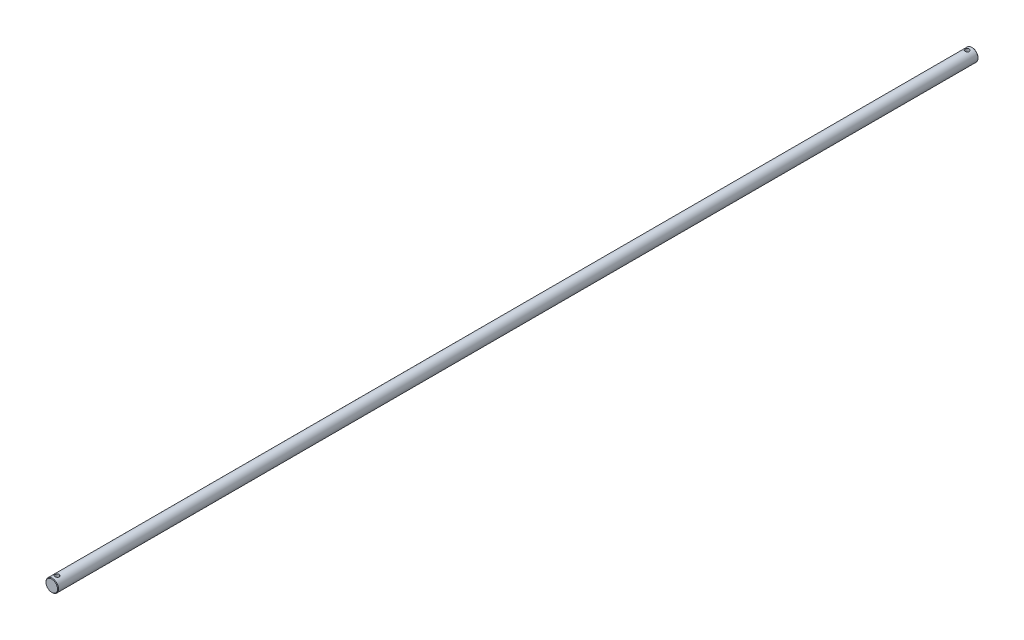
ISO-10303-21;
HEADER;
FILE_DESCRIPTION(('STEP AP214'),'2;1');
FILE_NAME('part.step','',(''),(''),'','','');
FILE_SCHEMA(('AUTOMOTIVE_DESIGN { 1 0 10303 214 1 1 1 1 }'));
ENDSEC;
DATA;
#1=APPLICATION_CONTEXT('core data for automotive mechanical design processes');
#2=APPLICATION_PROTOCOL_DEFINITION('international standard','automotive_design',2000,#1);
#3=PRODUCT_CONTEXT('',#1,'mechanical');
#4=PRODUCT('Part','Part','',(#3));
#5=PRODUCT_RELATED_PRODUCT_CATEGORY('part','',(#4));
#6=PRODUCT_DEFINITION_FORMATION('','',#4);
#7=PRODUCT_DEFINITION_CONTEXT('part definition',#1,'design');
#8=PRODUCT_DEFINITION('design','',#6,#7);
#9=PRODUCT_DEFINITION_SHAPE('','',#8);
#10=(LENGTH_UNIT() NAMED_UNIT(*) SI_UNIT(.MILLI.,.METRE.));
#11=(NAMED_UNIT(*) PLANE_ANGLE_UNIT() SI_UNIT($,.RADIAN.));
#12=(NAMED_UNIT(*) SI_UNIT($,.STERADIAN.) SOLID_ANGLE_UNIT());
#13=UNCERTAINTY_MEASURE_WITH_UNIT(LENGTH_MEASURE(1.E-05),#10,'distance_accuracy_value','');
#14=(GEOMETRIC_REPRESENTATION_CONTEXT(3) GLOBAL_UNCERTAINTY_ASSIGNED_CONTEXT((#13)) GLOBAL_UNIT_ASSIGNED_CONTEXT((#10,
#11,#12)) REPRESENTATION_CONTEXT('',''));
#15=CARTESIAN_POINT('',(0.,0.,0.));
#16=DIRECTION('',(0.,0.,1.));
#17=DIRECTION('',(1.,0.,0.));
#18=AXIS2_PLACEMENT_3D('',#15,#16,#17);
#19=CARTESIAN_POINT('',(0.,0.,-880.));
#20=DIRECTION('',(0.,0.,1.));
#21=DIRECTION('',(1.,0.,0.));
#22=AXIS2_PLACEMENT_3D('',#19,#20,#21);
#23=CYLINDRICAL_SURFACE('',#22,12.);
#24=CARTESIAN_POINT('',(0.,0.,879.));
#25=DIRECTION('',(0.,0.,1.));
#26=DIRECTION('',(1.,0.,0.));
#27=AXIS2_PLACEMENT_3D('',#24,#25,#26);
#28=CIRCLE('',#27,12.);
#29=CARTESIAN_POINT('',(12.,0.,879.));
#30=VERTEX_POINT('',#29);
#31=EDGE_CURVE('E42',#30,#30,#28,.F.);
#32=ORIENTED_EDGE('',*,*,#31,.T.);
#33=EDGE_LOOP('',(#32));
#34=FACE_BOUND('',#33,.T.);
#35=CARTESIAN_POINT('',(0.,0.,-879.000000000001));
#36=DIRECTION('',(0.,0.,1.));
#37=DIRECTION('',(1.,0.,0.));
#38=AXIS2_PLACEMENT_3D('',#35,#36,#37);
#39=CIRCLE('',#38,12.);
#40=CARTESIAN_POINT('',(12.,0.,-879.000000000001));
#41=VERTEX_POINT('',#40);
#42=EDGE_CURVE('E46',#41,#41,#39,.T.);
#43=ORIENTED_EDGE('',*,*,#42,.T.);
#44=EDGE_LOOP('',(#43));
#45=FACE_BOUND('',#44,.T.);
#46=CARTESIAN_POINT('',(0.,-12.,874.));
#47=CARTESIAN_POINT('',(0.218253451546889,-12.0000006120378,874.000001014927));
#48=CARTESIAN_POINT('',(0.436500778154188,-11.9939907803018,873.982078935491));
#49=CARTESIAN_POINT('',(0.866567043491888,-11.9706084081312,873.911083564731));
#50=CARTESIAN_POINT('',(1.07838531247529,-11.9532346880861,873.858006624204));
#51=CARTESIAN_POINT('',(1.48933115800712,-11.9090123162577,873.718723026464));
#52=CARTESIAN_POINT('',(1.68847930354413,-11.8821795092341,873.632571750163));
#53=CARTESIAN_POINT('',(2.06949974722129,-11.8217778286937,873.429835308647));
#54=CARTESIAN_POINT('',(2.25136862783485,-11.7882076267112,873.31324413999));
#55=CARTESIAN_POINT('',(2.59896670008907,-11.7165637777201,873.048696780565));
#56=CARTESIAN_POINT('',(2.76401480119319,-11.6783822585509,872.899875062958));
#57=CARTESIAN_POINT('',(3.06733077080831,-11.6024125913254,872.576931381174));
#58=CARTESIAN_POINT('',(3.2055927419579,-11.5646245316238,872.402803860286));
#59=CARTESIAN_POINT('',(3.45529976891137,-11.4925332990891,872.028059539214));
#60=CARTESIAN_POINT('',(3.56585943288387,-11.4583615710204,871.826825041071));
#61=CARTESIAN_POINT('',(3.75127549551108,-11.3990122167512,871.407295622166));
#62=CARTESIAN_POINT('',(3.82614278954791,-11.3738318464566,871.189005931351));
#63=CARTESIAN_POINT('',(3.93549384603581,-11.3364521307492,870.749307114012));
#64=CARTESIAN_POINT('',(3.97125379308399,-11.3238438306895,870.528251166038));
#65=CARTESIAN_POINT('',(4.005364493341,-11.3118262652752,870.082944983383));
#66=CARTESIAN_POINT('',(4.0037268064304,-11.312412921263,869.858695757186));
#67=CARTESIAN_POINT('',(3.96407961480177,-11.3263605999899,869.424253478192));
#68=CARTESIAN_POINT('',(3.92773565262442,-11.3391366334693,869.213886388226));
#69=CARTESIAN_POINT('',(3.82242465135523,-11.3750663077523,868.802426321479));
#70=CARTESIAN_POINT('',(3.75345370635799,-11.3982211910317,868.601334458238));
#71=CARTESIAN_POINT('',(3.58375623225407,-11.4527164455868,868.210349001664));
#72=CARTESIAN_POINT('',(3.48253619483259,-11.4841826318151,868.02068789813));
#73=CARTESIAN_POINT('',(3.25155642520899,-11.5517023429386,867.660516366873));
#74=CARTESIAN_POINT('',(3.12178844945504,-11.5877571915937,867.490011492264));
#75=CARTESIAN_POINT('',(2.82939733072993,-11.6626931667357,867.163633607359));
#76=CARTESIAN_POINT('',(2.66541260030544,-11.7016235742007,867.008989221964));
#77=CARTESIAN_POINT('',(2.31335827987991,-11.7762775354745,866.729074933346));
#78=CARTESIAN_POINT('',(2.12528638264315,-11.8120007815208,866.603807847342));
#79=CARTESIAN_POINT('',(1.72779045218514,-11.8766843175136,866.38521479906));
#80=CARTESIAN_POINT('',(1.51817310566535,-11.9055740003221,866.292218034637));
#81=CARTESIAN_POINT('',(1.08507633345799,-11.9528226857769,866.143187304177));
#82=CARTESIAN_POINT('',(0.861601752619789,-11.971185346195,866.087140498306));
#83=CARTESIAN_POINT('',(0.417535318117199,-11.9947050828577,866.015777335911));
#84=CARTESIAN_POINT('',(0.197238399459361,-12.0004000733492,865.998800763309));
#85=CARTESIAN_POINT('',(-0.243100279840978,-11.9995561077931,866.001330694394));
#86=CARTESIAN_POINT('',(-0.463142077278628,-11.9930192167745,866.020831039919));
#87=CARTESIAN_POINT('',(-0.890079465217045,-11.9688009886842,866.094447630944));
#88=CARTESIAN_POINT('',(-1.09717122733939,-11.9514479484477,866.147544824198));
#89=CARTESIAN_POINT('',(-1.4994238343183,-11.9076738732028,866.285573777867));
#90=CARTESIAN_POINT('',(-1.69458315403442,-11.881251681867,866.370509597871));
#91=CARTESIAN_POINT('',(-2.07315318557309,-11.8211572514916,866.572281727363));
#92=CARTESIAN_POINT('',(-2.2561198368686,-11.7873125902314,866.689898373133));
#93=CARTESIAN_POINT('',(-2.60025932054236,-11.7162101566505,866.952776600054));
#94=CARTESIAN_POINT('',(-2.7614254711823,-11.6789513437531,867.098046624127));
#95=CARTESIAN_POINT('',(-3.06501003122518,-11.6030739192178,867.419915004026));
#96=CARTESIAN_POINT('',(-3.20624387698308,-11.5644704434971,867.597636907707));
#97=CARTESIAN_POINT('',(-3.4570300892943,-11.4919989317883,867.975086271244));
#98=CARTESIAN_POINT('',(-3.56658219172405,-11.4581309352801,868.174813914536));
#99=CARTESIAN_POINT('',(-3.75038772166543,-11.3992956716553,868.59069206116));
#100=CARTESIAN_POINT('',(-3.82471252866007,-11.3743104317192,868.806808316675));
#101=CARTESIAN_POINT('',(-3.93557866703742,-11.336433292258,869.249514600176));
#102=CARTESIAN_POINT('',(-3.97213701981575,-11.3235359449456,869.476099861617));
#103=CARTESIAN_POINT('',(-4.00510512990937,-11.3119143549671,869.920788384164));
#104=CARTESIAN_POINT('',(-4.0034810292336,-11.3124960102966,870.138729361147));
#105=CARTESIAN_POINT('',(-3.96496917379477,-11.3260507929547,870.571060299688));
#106=CARTESIAN_POINT('',(-3.92808351783433,-11.3390231827745,870.78545047182));
#107=CARTESIAN_POINT('',(-3.82148725251738,-11.3753809721957,871.20054265201));
#108=CARTESIAN_POINT('',(-3.75241338406208,-11.3985639208991,871.401427300018));
#109=CARTESIAN_POINT('',(-3.58391746303902,-11.4526559527387,871.788909627753));
#110=CARTESIAN_POINT('',(-3.48448867421524,-11.4835667505357,871.975504124752));
#111=CARTESIAN_POINT('',(-3.25304277033373,-11.5513131690418,872.337934679692));
#112=CARTESIAN_POINT('',(-3.11979297105836,-11.5883484656855,872.512946007594));
#113=CARTESIAN_POINT('',(-2.82657153254263,-11.6633342513301,872.838759253537));
#114=CARTESIAN_POINT('',(-2.66659233780593,-11.7012849964949,872.989554302752));
#115=CARTESIAN_POINT('',(-2.31696622768271,-11.7756012210218,873.268577649157));
#116=CARTESIAN_POINT('',(-2.12640605399888,-11.8118472720503,873.395697391004));
#117=CARTESIAN_POINT('',(-1.72542942962647,-11.8770396469045,873.615961715403));
#118=CARTESIAN_POINT('',(-1.51501807252936,-11.9059878363172,873.709114983688));
#119=CARTESIAN_POINT('',(-1.08997458880387,-11.9522206027417,873.854886529955));
#120=CARTESIAN_POINT('',(-0.875951030705609,-11.9699684969009,873.909129865053));
#121=CARTESIAN_POINT('',(-0.441281664040974,-11.9938562825689,873.981681122708));
#122=CARTESIAN_POINT('',(-0.220637702274977,-11.9999993812762,873.999998973986));
#123=CARTESIAN_POINT('',(0.,-12.,874.));
#124=B_SPLINE_CURVE_WITH_KNOTS('',3,(#46,#47,#48,#49,#50,#51,#52,#53,#54,#55,#56,#57,#58,#59,
#60,#61,#62,#63,#64,#65,#66,#67,#68,#69,#70,#71,#72,#73,#74,#75,#76,#77,#78,#79,#80,#81,#82,#83,
#84,#85,#86,#87,#88,#89,#90,#91,#92,#93,#94,#95,#96,#97,#98,#99,#100,#101,#102,#103,#104,#105,
#106,#107,#108,#109,#110,#111,#112,#113,#114,#115,#116,#117,#118,#119,#120,#121,#122,#123),
.UNSPECIFIED.,.T.,.F.,(4,2,2,2,2,2,2,2,2,2,2,2,2,2,2,2,2,2,2,2,2,2,2,2,2,2,2,2,2,2,2,2,2,2,2,2,
2,2,4),(0.,0.65394842410404,1.30796474107008,1.96089069148111,2.6139455111964,3.28738737131023,
3.96097733150114,4.6539353929387,5.34668178771322,6.01607702967358,6.68526535949948,
7.32387306208105,7.96255723427578,8.61152684626173,9.26068410238489,9.94373223251129,
10.6268458387213,11.3167362260708,12.0063867551449,12.6661433270633,13.3257885266236,
13.9663263191851,14.6069458114207,15.264415993806,15.9220872329322,16.6096409152866,
17.2972003294564,17.9833605531272,18.6692113882901,19.3198266426269,19.9704031741116,
20.6086234832732,21.2469855270956,21.9132026677287,22.5796084450078,23.2719864334606,
23.9641872461548,24.6254623350091,25.2865546415821),.UNSPECIFIED.);
#125=CARTESIAN_POINT('',(0.,-12.,874.));
#126=VERTEX_POINT('',#125);
#127=EDGE_CURVE('E88',#126,#126,#124,.T.);
#128=ORIENTED_EDGE('',*,*,#127,.T.);
#129=EDGE_LOOP('',(#128));
#130=FACE_BOUND('',#129,.T.);
#131=CARTESIAN_POINT('',(0.,-12.,-866.));
#132=CARTESIAN_POINT('',(0.218253451546889,-12.0000006120378,-865.999998985073));
#133=CARTESIAN_POINT('',(0.436500778154188,-11.9939907803018,-866.017921064509));
#134=CARTESIAN_POINT('',(0.866567043491888,-11.9706084081312,-866.088916435269));
#135=CARTESIAN_POINT('',(1.07838531247529,-11.9532346880861,-866.141993375796));
#136=CARTESIAN_POINT('',(1.48933115800712,-11.9090123162577,-866.281276973536));
#137=CARTESIAN_POINT('',(1.68847930354413,-11.8821795092341,-866.367428249837));
#138=CARTESIAN_POINT('',(2.06949974722129,-11.8217778286937,-866.570164691353));
#139=CARTESIAN_POINT('',(2.25136862783485,-11.7882076267112,-866.68675586001));
#140=CARTESIAN_POINT('',(2.59896670008907,-11.7165637777201,-866.951303219435));
#141=CARTESIAN_POINT('',(2.76401480119319,-11.6783822585509,-867.100124937042));
#142=CARTESIAN_POINT('',(3.06733077080831,-11.6024125913254,-867.423068618826));
#143=CARTESIAN_POINT('',(3.2055927419579,-11.5646245316238,-867.597196139714));
#144=CARTESIAN_POINT('',(3.45529976891137,-11.4925332990891,-867.971940460786));
#145=CARTESIAN_POINT('',(3.56585943288387,-11.4583615710204,-868.173174958929));
#146=CARTESIAN_POINT('',(3.75127549551108,-11.3990122167512,-868.592704377834));
#147=CARTESIAN_POINT('',(3.82614278954791,-11.3738318464566,-868.810994068649));
#148=CARTESIAN_POINT('',(3.93549384603581,-11.3364521307492,-869.250692885988));
#149=CARTESIAN_POINT('',(3.97125379308399,-11.3238438306895,-869.471748833962));
#150=CARTESIAN_POINT('',(4.005364493341,-11.3118262652752,-869.917055016617));
#151=CARTESIAN_POINT('',(4.0037268064304,-11.312412921263,-870.141304242814));
#152=CARTESIAN_POINT('',(3.96407961480177,-11.3263605999899,-870.575746521808));
#153=CARTESIAN_POINT('',(3.92773565262442,-11.3391366334693,-870.786113611774));
#154=CARTESIAN_POINT('',(3.82242465135523,-11.3750663077523,-871.197573678521));
#155=CARTESIAN_POINT('',(3.75345370635799,-11.3982211910317,-871.398665541762));
#156=CARTESIAN_POINT('',(3.58375623225406,-11.4527164455868,-871.789650998336));
#157=CARTESIAN_POINT('',(3.48253619483257,-11.4841826318151,-871.97931210187));
#158=CARTESIAN_POINT('',(3.25155642520896,-11.5517023429386,-872.339483633127));
#159=CARTESIAN_POINT('',(3.12178844945502,-11.5877571915938,-872.509988507736));
#160=CARTESIAN_POINT('',(2.82939733072993,-11.6626931667357,-872.836366392641));
#161=CARTESIAN_POINT('',(2.66541260030544,-11.7016235742007,-872.991010778036));
#162=CARTESIAN_POINT('',(2.31335827987991,-11.7762775354745,-873.270925066654));
#163=CARTESIAN_POINT('',(2.12528638264315,-11.8120007815208,-873.396192152658));
#164=CARTESIAN_POINT('',(1.72779045218514,-11.8766843175136,-873.61478520094));
#165=CARTESIAN_POINT('',(1.51817310566535,-11.9055740003221,-873.707781965363));
#166=CARTESIAN_POINT('',(1.08507633345799,-11.9528226857769,-873.856812695823));
#167=CARTESIAN_POINT('',(0.861601752619789,-11.971185346195,-873.912859501694));
#168=CARTESIAN_POINT('',(0.417535318117199,-11.9947050828577,-873.984222664089));
#169=CARTESIAN_POINT('',(0.197238399459361,-12.0004000733492,-874.001199236691));
#170=CARTESIAN_POINT('',(-0.243100279840978,-11.9995561077931,-873.998669305606));
#171=CARTESIAN_POINT('',(-0.463142077278629,-11.9930192167745,-873.979168960081));
#172=CARTESIAN_POINT('',(-0.890079465217045,-11.9688009886842,-873.905552369056));
#173=CARTESIAN_POINT('',(-1.09717122733939,-11.9514479484477,-873.852455175802));
#174=CARTESIAN_POINT('',(-1.4994238343183,-11.9076738732028,-873.714426222133));
#175=CARTESIAN_POINT('',(-1.69458315403443,-11.881251681867,-873.629490402129));
#176=CARTESIAN_POINT('',(-2.07315318557311,-11.8211572514916,-873.427718272637));
#177=CARTESIAN_POINT('',(-2.25611983686863,-11.7873125902314,-873.310101626867));
#178=CARTESIAN_POINT('',(-2.60025932054238,-11.7162101566505,-873.047223399946));
#179=CARTESIAN_POINT('',(-2.76142547118232,-11.6789513437531,-872.901953375873));
#180=CARTESIAN_POINT('',(-3.06501003122519,-11.6030739192178,-872.580084995974));
#181=CARTESIAN_POINT('',(-3.20624387698308,-11.5644704434971,-872.402363092293));
#182=CARTESIAN_POINT('',(-3.4570300892943,-11.4919989317883,-872.024913728756));
#183=CARTESIAN_POINT('',(-3.56658219172405,-11.4581309352801,-871.825186085464));
#184=CARTESIAN_POINT('',(-3.75038772166542,-11.3992956716554,-871.409307938841));
#185=CARTESIAN_POINT('',(-3.82471252866004,-11.3743104317192,-871.193191683325));
#186=CARTESIAN_POINT('',(-3.9355786670374,-11.336433292258,-870.750485399824));
#187=CARTESIAN_POINT('',(-3.97213701981575,-11.3235359449456,-870.523900138383));
#188=CARTESIAN_POINT('',(-4.00510512990937,-11.3119143549671,-870.079211615836));
#189=CARTESIAN_POINT('',(-4.0034810292336,-11.3124960102966,-869.861270638853));
#190=CARTESIAN_POINT('',(-3.96496917379478,-11.3260507929547,-869.428939700312));
#191=CARTESIAN_POINT('',(-3.92808351783434,-11.3390231827745,-869.21454952818));
#192=CARTESIAN_POINT('',(-3.82148725251736,-11.3753809721957,-868.79945734799));
#193=CARTESIAN_POINT('',(-3.75241338406202,-11.3985639208991,-868.598572699982));
#194=CARTESIAN_POINT('',(-3.58391746303895,-11.4526559527388,-868.211090372247));
#195=CARTESIAN_POINT('',(-3.48448867421521,-11.4835667505357,-868.024495875248));
#196=CARTESIAN_POINT('',(-3.25304277033373,-11.5513131690418,-867.662065320308));
#197=CARTESIAN_POINT('',(-3.11979297105832,-11.5883484656855,-867.487053992406));
#198=CARTESIAN_POINT('',(-2.82657153254258,-11.6633342513301,-867.161240746463));
#199=CARTESIAN_POINT('',(-2.66659233780591,-11.7012849964949,-867.010445697248));
#200=CARTESIAN_POINT('',(-2.31696622768272,-11.7756012210218,-866.731422350843));
#201=CARTESIAN_POINT('',(-2.12640605399888,-11.8118472720503,-866.604302608996));
#202=CARTESIAN_POINT('',(-1.72542942962646,-11.8770396469045,-866.384038284597));
#203=CARTESIAN_POINT('',(-1.51501807252936,-11.9059878363172,-866.290885016312));
#204=CARTESIAN_POINT('',(-1.08997458880387,-11.9522206027417,-866.145113470045));
#205=CARTESIAN_POINT('',(-0.875951030705609,-11.9699684969009,-866.090870134947));
#206=CARTESIAN_POINT('',(-0.441281664040973,-11.9938562825689,-866.018318877292));
#207=CARTESIAN_POINT('',(-0.220637702274977,-11.9999993812762,-866.000001026014));
#208=CARTESIAN_POINT('',(0.,-12.,-866.));
#209=B_SPLINE_CURVE_WITH_KNOTS('',3,(#131,#132,#133,#134,#135,#136,#137,#138,#139,#140,#141,
#142,#143,#144,#145,#146,#147,#148,#149,#150,#151,#152,#153,#154,#155,#156,#157,#158,#159,#160,
#161,#162,#163,#164,#165,#166,#167,#168,#169,#170,#171,#172,#173,#174,#175,#176,#177,#178,#179,
#180,#181,#182,#183,#184,#185,#186,#187,#188,#189,#190,#191,#192,#193,#194,#195,#196,#197,#198,
#199,#200,#201,#202,#203,#204,#205,#206,#207,#208),.UNSPECIFIED.,.T.,.F.,(4,2,2,2,2,2,2,2,2,2,2,
2,2,2,2,2,2,2,2,2,2,2,2,2,2,2,2,2,2,2,2,2,2,2,2,2,2,2,4),(0.,0.65394842410404,1.30796474107008,
1.96089069148111,2.6139455111964,3.28738737131023,3.96097733150114,4.6539353929387,
5.34668178771322,6.01607702967358,6.68526535949948,7.32387306208105,7.96255723427578,
8.61152684626185,9.26068410238489,9.94373223251129,10.6268458387213,11.3167362260708,
12.0063867551449,12.6661433270633,13.3257885266236,13.9663263191851,14.6069458114207,
15.2644159938061,15.9220872329322,16.6096409152866,17.2972003294564,17.9833605531271,
18.6692113882901,19.3198266426269,19.9704031741116,20.6086234832733,21.2469855270956,
21.9132026677287,22.5796084450078,23.2719864334606,23.9641872461548,24.6254623350091,
25.2865546415821),.UNSPECIFIED.);
#210=CARTESIAN_POINT('',(0.,-12.,-866.));
#211=VERTEX_POINT('',#210);
#212=EDGE_CURVE('E62',#211,#211,#209,.T.);
#213=ORIENTED_EDGE('',*,*,#212,.T.);
#214=EDGE_LOOP('',(#213));
#215=FACE_BOUND('',#214,.T.);
#216=CARTESIAN_POINT('',(0.,12.,-874.));
#217=CARTESIAN_POINT('',(-0.218253451546889,12.0000006120378,-874.000001014927));
#218=CARTESIAN_POINT('',(-0.436500778154188,11.9939907803018,-873.982078935491));
#219=CARTESIAN_POINT('',(-0.866567043491888,11.9706084081312,-873.911083564731));
#220=CARTESIAN_POINT('',(-1.07838531247529,11.9532346880861,-873.858006624204));
#221=CARTESIAN_POINT('',(-1.48933115800712,11.9090123162577,-873.718723026464));
#222=CARTESIAN_POINT('',(-1.68847930354413,11.8821795092341,-873.632571750163));
#223=CARTESIAN_POINT('',(-2.06949974722129,11.8217778286937,-873.429835308647));
#224=CARTESIAN_POINT('',(-2.25136862783485,11.7882076267112,-873.31324413999));
#225=CARTESIAN_POINT('',(-2.59896670008907,11.7165637777201,-873.048696780565));
#226=CARTESIAN_POINT('',(-2.76401480119319,11.6783822585509,-872.899875062958));
#227=CARTESIAN_POINT('',(-3.06733077080831,11.6024125913254,-872.576931381174));
#228=CARTESIAN_POINT('',(-3.2055927419579,11.5646245316238,-872.402803860286));
#229=CARTESIAN_POINT('',(-3.45529976891137,11.4925332990891,-872.028059539214));
#230=CARTESIAN_POINT('',(-3.56585943288387,11.4583615710204,-871.826825041071));
#231=CARTESIAN_POINT('',(-3.75127549551108,11.3990122167512,-871.407295622166));
#232=CARTESIAN_POINT('',(-3.82614278954791,11.3738318464566,-871.189005931351));
#233=CARTESIAN_POINT('',(-3.93549384603581,11.3364521307492,-870.749307114012));
#234=CARTESIAN_POINT('',(-3.97125379308399,11.3238438306895,-870.528251166038));
#235=CARTESIAN_POINT('',(-4.005364493341,11.3118262652752,-870.082944983383));
#236=CARTESIAN_POINT('',(-4.0037268064304,11.312412921263,-869.858695757186));
#237=CARTESIAN_POINT('',(-3.96407961480177,11.3263605999899,-869.424253478192));
#238=CARTESIAN_POINT('',(-3.92773565262442,11.3391366334693,-869.213886388226));
#239=CARTESIAN_POINT('',(-3.82242465135523,11.3750663077523,-868.802426321479));
#240=CARTESIAN_POINT('',(-3.75345370635799,11.3982211910317,-868.601334458238));
#241=CARTESIAN_POINT('',(-3.58375623225407,11.4527164455868,-868.210349001664));
#242=CARTESIAN_POINT('',(-3.48253619483259,11.4841826318151,-868.02068789813));
#243=CARTESIAN_POINT('',(-3.25155642520899,11.5517023429386,-867.660516366873));
#244=CARTESIAN_POINT('',(-3.12178844945504,11.5877571915937,-867.490011492264));
#245=CARTESIAN_POINT('',(-2.82939733072993,11.6626931667357,-867.163633607359));
#246=CARTESIAN_POINT('',(-2.66541260030544,11.7016235742007,-867.008989221964));
#247=CARTESIAN_POINT('',(-2.31335827987991,11.7762775354745,-866.729074933346));
#248=CARTESIAN_POINT('',(-2.12528638264315,11.8120007815208,-866.603807847342));
#249=CARTESIAN_POINT('',(-1.72779045218514,11.8766843175136,-866.38521479906));
#250=CARTESIAN_POINT('',(-1.51817310566535,11.9055740003221,-866.292218034637));
#251=CARTESIAN_POINT('',(-1.08507633345799,11.9528226857769,-866.143187304177));
#252=CARTESIAN_POINT('',(-0.861601752619789,11.971185346195,-866.087140498306));
#253=CARTESIAN_POINT('',(-0.417535318117199,11.9947050828577,-866.015777335911));
#254=CARTESIAN_POINT('',(-0.197238399459361,12.0004000733492,-865.998800763309));
#255=CARTESIAN_POINT('',(0.243100279840978,11.9995561077931,-866.001330694394));
#256=CARTESIAN_POINT('',(0.463142077278628,11.9930192167745,-866.020831039919));
#257=CARTESIAN_POINT('',(0.890079465217045,11.9688009886842,-866.094447630944));
#258=CARTESIAN_POINT('',(1.09717122733939,11.9514479484477,-866.147544824198));
#259=CARTESIAN_POINT('',(1.4994238343183,11.9076738732028,-866.285573777867));
#260=CARTESIAN_POINT('',(1.69458315403442,11.881251681867,-866.370509597871));
#261=CARTESIAN_POINT('',(2.07315318557309,11.8211572514916,-866.572281727363));
#262=CARTESIAN_POINT('',(2.2561198368686,11.7873125902314,-866.689898373133));
#263=CARTESIAN_POINT('',(2.60025932054236,11.7162101566505,-866.952776600054));
#264=CARTESIAN_POINT('',(2.7614254711823,11.6789513437531,-867.098046624127));
#265=CARTESIAN_POINT('',(3.06501003122518,11.6030739192178,-867.419915004026));
#266=CARTESIAN_POINT('',(3.20624387698308,11.5644704434971,-867.597636907707));
#267=CARTESIAN_POINT('',(3.4570300892943,11.4919989317883,-867.975086271244));
#268=CARTESIAN_POINT('',(3.56658219172405,11.4581309352801,-868.174813914536));
#269=CARTESIAN_POINT('',(3.75038772166543,11.3992956716553,-868.59069206116));
#270=CARTESIAN_POINT('',(3.82471252866007,11.3743104317192,-868.806808316675));
#271=CARTESIAN_POINT('',(3.93557866703742,11.336433292258,-869.249514600176));
#272=CARTESIAN_POINT('',(3.97213701981575,11.3235359449456,-869.476099861617));
#273=CARTESIAN_POINT('',(4.00510512990937,11.3119143549671,-869.920788384164));
#274=CARTESIAN_POINT('',(4.0034810292336,11.3124960102966,-870.138729361147));
#275=CARTESIAN_POINT('',(3.96496917379477,11.3260507929547,-870.571060299688));
#276=CARTESIAN_POINT('',(3.92808351783433,11.3390231827745,-870.78545047182));
#277=CARTESIAN_POINT('',(3.82148725251738,11.3753809721957,-871.20054265201));
#278=CARTESIAN_POINT('',(3.75241338406208,11.3985639208991,-871.401427300018));
#279=CARTESIAN_POINT('',(3.58391746303902,11.4526559527387,-871.788909627753));
#280=CARTESIAN_POINT('',(3.48448867421524,11.4835667505357,-871.975504124752));
#281=CARTESIAN_POINT('',(3.25304277033373,11.5513131690418,-872.337934679692));
#282=CARTESIAN_POINT('',(3.11979297105836,11.5883484656855,-872.512946007594));
#283=CARTESIAN_POINT('',(2.82657153254263,11.6633342513301,-872.838759253537));
#284=CARTESIAN_POINT('',(2.66659233780593,11.7012849964949,-872.989554302752));
#285=CARTESIAN_POINT('',(2.31696622768271,11.7756012210218,-873.268577649157));
#286=CARTESIAN_POINT('',(2.12640605399888,11.8118472720503,-873.395697391004));
#287=CARTESIAN_POINT('',(1.72542942962647,11.8770396469045,-873.615961715403));
#288=CARTESIAN_POINT('',(1.51501807252936,11.9059878363172,-873.709114983688));
#289=CARTESIAN_POINT('',(1.08997458880387,11.9522206027417,-873.854886529955));
#290=CARTESIAN_POINT('',(0.875951030705609,11.9699684969009,-873.909129865053));
#291=CARTESIAN_POINT('',(0.441281664040974,11.9938562825689,-873.981681122708));
#292=CARTESIAN_POINT('',(0.220637702274977,11.9999993812762,-873.999998973986));
#293=CARTESIAN_POINT('',(0.,12.,-874.));
#294=B_SPLINE_CURVE_WITH_KNOTS('',3,(#216,#217,#218,#219,#220,#221,#222,#223,#224,#225,#226,
#227,#228,#229,#230,#231,#232,#233,#234,#235,#236,#237,#238,#239,#240,#241,#242,#243,#244,#245,
#246,#247,#248,#249,#250,#251,#252,#253,#254,#255,#256,#257,#258,#259,#260,#261,#262,#263,#264,
#265,#266,#267,#268,#269,#270,#271,#272,#273,#274,#275,#276,#277,#278,#279,#280,#281,#282,#283,
#284,#285,#286,#287,#288,#289,#290,#291,#292,#293),.UNSPECIFIED.,.T.,.F.,(4,2,2,2,2,2,2,2,2,2,2,
2,2,2,2,2,2,2,2,2,2,2,2,2,2,2,2,2,2,2,2,2,2,2,2,2,2,2,4),(0.,0.65394842410404,1.30796474107008,
1.96089069148111,2.6139455111964,3.28738737131023,3.96097733150114,4.6539353929387,
5.34668178771322,6.01607702967358,6.68526535949948,7.32387306208105,7.96255723427578,
8.61152684626173,9.26068410238489,9.94373223251129,10.6268458387213,11.3167362260708,
12.0063867551449,12.6661433270633,13.3257885266236,13.9663263191851,14.6069458114207,
15.264415993806,15.9220872329322,16.6096409152866,17.2972003294564,17.9833605531272,
18.6692113882901,19.3198266426269,19.9704031741116,20.6086234832732,21.2469855270956,
21.9132026677287,22.5796084450078,23.2719864334606,23.9641872461548,24.6254623350091,
25.2865546415821),.UNSPECIFIED.);
#295=CARTESIAN_POINT('',(0.,12.,-874.));
#296=VERTEX_POINT('',#295);
#297=EDGE_CURVE('E55',#296,#296,#294,.T.);
#298=ORIENTED_EDGE('',*,*,#297,.F.);
#299=EDGE_LOOP('',(#298));
#300=FACE_BOUND('',#299,.T.);
#301=CARTESIAN_POINT('',(0.,12.,866.));
#302=CARTESIAN_POINT('',(-0.218253451546889,12.0000006120378,865.999998985073));
#303=CARTESIAN_POINT('',(-0.436500778154188,11.9939907803018,866.017921064509));
#304=CARTESIAN_POINT('',(-0.866567043491888,11.9706084081312,866.088916435269));
#305=CARTESIAN_POINT('',(-1.07838531247529,11.9532346880861,866.141993375796));
#306=CARTESIAN_POINT('',(-1.48933115800712,11.9090123162577,866.281276973536));
#307=CARTESIAN_POINT('',(-1.68847930354413,11.8821795092341,866.367428249837));
#308=CARTESIAN_POINT('',(-2.06949974722129,11.8217778286937,866.570164691353));
#309=CARTESIAN_POINT('',(-2.25136862783485,11.7882076267112,866.68675586001));
#310=CARTESIAN_POINT('',(-2.59896670008907,11.7165637777201,866.951303219435));
#311=CARTESIAN_POINT('',(-2.76401480119319,11.6783822585509,867.100124937042));
#312=CARTESIAN_POINT('',(-3.06733077080831,11.6024125913254,867.423068618826));
#313=CARTESIAN_POINT('',(-3.2055927419579,11.5646245316238,867.597196139714));
#314=CARTESIAN_POINT('',(-3.45529976891137,11.4925332990891,867.971940460786));
#315=CARTESIAN_POINT('',(-3.56585943288387,11.4583615710204,868.173174958929));
#316=CARTESIAN_POINT('',(-3.75127549551108,11.3990122167512,868.592704377834));
#317=CARTESIAN_POINT('',(-3.82614278954791,11.3738318464566,868.810994068649));
#318=CARTESIAN_POINT('',(-3.93549384603581,11.3364521307492,869.250692885988));
#319=CARTESIAN_POINT('',(-3.97125379308399,11.3238438306895,869.471748833962));
#320=CARTESIAN_POINT('',(-4.005364493341,11.3118262652752,869.917055016617));
#321=CARTESIAN_POINT('',(-4.0037268064304,11.312412921263,870.141304242814));
#322=CARTESIAN_POINT('',(-3.96407961480177,11.3263605999899,870.575746521808));
#323=CARTESIAN_POINT('',(-3.92773565262442,11.3391366334693,870.786113611774));
#324=CARTESIAN_POINT('',(-3.82242465135523,11.3750663077523,871.197573678521));
#325=CARTESIAN_POINT('',(-3.75345370635799,11.3982211910317,871.398665541762));
#326=CARTESIAN_POINT('',(-3.58375623225406,11.4527164455868,871.789650998336));
#327=CARTESIAN_POINT('',(-3.48253619483257,11.4841826318151,871.97931210187));
#328=CARTESIAN_POINT('',(-3.25155642520896,11.5517023429386,872.339483633127));
#329=CARTESIAN_POINT('',(-3.12178844945502,11.5877571915938,872.509988507736));
#330=CARTESIAN_POINT('',(-2.82939733072993,11.6626931667357,872.836366392641));
#331=CARTESIAN_POINT('',(-2.66541260030544,11.7016235742007,872.991010778036));
#332=CARTESIAN_POINT('',(-2.31335827987991,11.7762775354745,873.270925066654));
#333=CARTESIAN_POINT('',(-2.12528638264315,11.8120007815208,873.396192152658));
#334=CARTESIAN_POINT('',(-1.72779045218514,11.8766843175136,873.61478520094));
#335=CARTESIAN_POINT('',(-1.51817310566535,11.9055740003221,873.707781965363));
#336=CARTESIAN_POINT('',(-1.08507633345799,11.9528226857769,873.856812695823));
#337=CARTESIAN_POINT('',(-0.861601752619789,11.971185346195,873.912859501694));
#338=CARTESIAN_POINT('',(-0.417535318117199,11.9947050828577,873.984222664089));
#339=CARTESIAN_POINT('',(-0.197238399459361,12.0004000733492,874.001199236691));
#340=CARTESIAN_POINT('',(0.243100279840978,11.9995561077931,873.998669305606));
#341=CARTESIAN_POINT('',(0.463142077278629,11.9930192167745,873.979168960081));
#342=CARTESIAN_POINT('',(0.890079465217045,11.9688009886842,873.905552369056));
#343=CARTESIAN_POINT('',(1.09717122733939,11.9514479484477,873.852455175802));
#344=CARTESIAN_POINT('',(1.4994238343183,11.9076738732028,873.714426222133));
#345=CARTESIAN_POINT('',(1.69458315403443,11.881251681867,873.629490402129));
#346=CARTESIAN_POINT('',(2.07315318557311,11.8211572514916,873.427718272637));
#347=CARTESIAN_POINT('',(2.25611983686863,11.7873125902314,873.310101626867));
#348=CARTESIAN_POINT('',(2.60025932054238,11.7162101566505,873.047223399946));
#349=CARTESIAN_POINT('',(2.76142547118232,11.6789513437531,872.901953375873));
#350=CARTESIAN_POINT('',(3.06501003122519,11.6030739192178,872.580084995974));
#351=CARTESIAN_POINT('',(3.20624387698308,11.5644704434971,872.402363092293));
#352=CARTESIAN_POINT('',(3.4570300892943,11.4919989317883,872.024913728756));
#353=CARTESIAN_POINT('',(3.56658219172405,11.4581309352801,871.825186085464));
#354=CARTESIAN_POINT('',(3.75038772166542,11.3992956716554,871.409307938841));
#355=CARTESIAN_POINT('',(3.82471252866004,11.3743104317192,871.193191683325));
#356=CARTESIAN_POINT('',(3.9355786670374,11.336433292258,870.750485399824));
#357=CARTESIAN_POINT('',(3.97213701981575,11.3235359449456,870.523900138383));
#358=CARTESIAN_POINT('',(4.00510512990937,11.3119143549671,870.079211615836));
#359=CARTESIAN_POINT('',(4.0034810292336,11.3124960102966,869.861270638853));
#360=CARTESIAN_POINT('',(3.96496917379478,11.3260507929547,869.428939700312));
#361=CARTESIAN_POINT('',(3.92808351783434,11.3390231827745,869.21454952818));
#362=CARTESIAN_POINT('',(3.82148725251736,11.3753809721957,868.79945734799));
#363=CARTESIAN_POINT('',(3.75241338406202,11.3985639208991,868.598572699982));
#364=CARTESIAN_POINT('',(3.58391746303895,11.4526559527388,868.211090372247));
#365=CARTESIAN_POINT('',(3.48448867421521,11.4835667505357,868.024495875248));
#366=CARTESIAN_POINT('',(3.25304277033373,11.5513131690418,867.662065320308));
#367=CARTESIAN_POINT('',(3.11979297105832,11.5883484656855,867.487053992406));
#368=CARTESIAN_POINT('',(2.82657153254258,11.6633342513301,867.161240746463));
#369=CARTESIAN_POINT('',(2.66659233780591,11.7012849964949,867.010445697248));
#370=CARTESIAN_POINT('',(2.31696622768272,11.7756012210218,866.731422350843));
#371=CARTESIAN_POINT('',(2.12640605399888,11.8118472720503,866.604302608996));
#372=CARTESIAN_POINT('',(1.72542942962646,11.8770396469045,866.384038284597));
#373=CARTESIAN_POINT('',(1.51501807252936,11.9059878363172,866.290885016312));
#374=CARTESIAN_POINT('',(1.08997458880387,11.9522206027417,866.145113470045));
#375=CARTESIAN_POINT('',(0.875951030705609,11.9699684969009,866.090870134947));
#376=CARTESIAN_POINT('',(0.441281664040973,11.9938562825689,866.018318877292));
#377=CARTESIAN_POINT('',(0.220637702274977,11.9999993812762,866.000001026014));
#378=CARTESIAN_POINT('',(0.,12.,866.));
#379=B_SPLINE_CURVE_WITH_KNOTS('',3,(#301,#302,#303,#304,#305,#306,#307,#308,#309,#310,#311,
#312,#313,#314,#315,#316,#317,#318,#319,#320,#321,#322,#323,#324,#325,#326,#327,#328,#329,#330,
#331,#332,#333,#334,#335,#336,#337,#338,#339,#340,#341,#342,#343,#344,#345,#346,#347,#348,#349,
#350,#351,#352,#353,#354,#355,#356,#357,#358,#359,#360,#361,#362,#363,#364,#365,#366,#367,#368,
#369,#370,#371,#372,#373,#374,#375,#376,#377,#378),.UNSPECIFIED.,.T.,.F.,(4,2,2,2,2,2,2,2,2,2,2,
2,2,2,2,2,2,2,2,2,2,2,2,2,2,2,2,2,2,2,2,2,2,2,2,2,2,2,4),(0.,0.65394842410404,1.30796474107008,
1.96089069148111,2.6139455111964,3.28738737131023,3.96097733150114,4.6539353929387,
5.34668178771322,6.01607702967358,6.68526535949948,7.32387306208105,7.96255723427578,
8.61152684626185,9.26068410238489,9.94373223251129,10.6268458387213,11.3167362260708,
12.0063867551449,12.6661433270633,13.3257885266236,13.9663263191851,14.6069458114207,
15.2644159938061,15.9220872329322,16.6096409152866,17.2972003294564,17.9833605531271,
18.6692113882901,19.3198266426269,19.9704031741116,20.6086234832733,21.2469855270956,
21.9132026677287,22.5796084450078,23.2719864334606,23.9641872461548,24.6254623350091,
25.2865546415821),.UNSPECIFIED.);
#380=CARTESIAN_POINT('',(0.,12.,866.));
#381=VERTEX_POINT('',#380);
#382=EDGE_CURVE('E83',#381,#381,#379,.T.);
#383=ORIENTED_EDGE('',*,*,#382,.F.);
#384=EDGE_LOOP('',(#383));
#385=FACE_BOUND('',#384,.T.);
#386=ADVANCED_FACE('F35',(#34,#45,#130,#215,#300,#385),#23,.T.);
#387=CARTESIAN_POINT('',(0.,0.,-880.));
#388=DIRECTION('',(0.,0.,1.));
#389=DIRECTION('',(1.,0.,0.));
#390=AXIS2_PLACEMENT_3D('',#387,#388,#389);
#391=PLANE('',#390);
#392=CARTESIAN_POINT('',(0.,0.,-880.));
#393=DIRECTION('',(0.,0.,1.));
#394=DIRECTION('',(1.,0.,0.));
#395=AXIS2_PLACEMENT_3D('',#392,#393,#394);
#396=CIRCLE('',#395,11.0000000000003);
#397=CARTESIAN_POINT('',(11.0000000000003,0.,-880.));
#398=VERTEX_POINT('',#397);
#399=EDGE_CURVE('E10',#398,#398,#396,.F.);
#400=ORIENTED_EDGE('',*,*,#399,.T.);
#401=EDGE_LOOP('',(#400));
#402=FACE_BOUND('',#401,.T.);
#403=ADVANCED_FACE('F100',(#402),#391,.F.);
#404=CARTESIAN_POINT('',(0.,0.,880.));
#405=DIRECTION('',(0.,0.,1.));
#406=DIRECTION('',(1.,0.,0.));
#407=AXIS2_PLACEMENT_3D('',#404,#405,#406);
#408=PLANE('',#407);
#409=CARTESIAN_POINT('',(0.,0.,880.));
#410=DIRECTION('',(0.,0.,1.));
#411=DIRECTION('',(1.,0.,0.));
#412=AXIS2_PLACEMENT_3D('',#409,#410,#411);
#413=CIRCLE('',#412,11.0000000000003);
#414=CARTESIAN_POINT('',(11.0000000000003,0.,880.));
#415=VERTEX_POINT('',#414);
#416=EDGE_CURVE('E50',#415,#415,#413,.T.);
#417=ORIENTED_EDGE('',*,*,#416,.T.);
#418=EDGE_LOOP('',(#417));
#419=FACE_BOUND('',#418,.T.);
#420=ADVANCED_FACE('F111',(#419),#408,.T.);
#421=CARTESIAN_POINT('',(0.,12.001,-870.));
#422=DIRECTION('',(0.,-1.,0.));
#423=DIRECTION('',(0.,0.,-1.));
#424=AXIS2_PLACEMENT_3D('',#421,#422,#423);
#425=CYLINDRICAL_SURFACE('',#424,4.);
#426=ORIENTED_EDGE('',*,*,#297,.T.);
#427=EDGE_LOOP('',(#426));
#428=FACE_BOUND('',#427,.T.);
#429=ORIENTED_EDGE('',*,*,#212,.F.);
#430=EDGE_LOOP('',(#429));
#431=FACE_BOUND('',#430,.T.);
#432=ADVANCED_FACE('F68',(#428,#431),#425,.F.);
#433=CARTESIAN_POINT('',(0.,12.001,870.));
#434=DIRECTION('',(0.,-1.,0.));
#435=DIRECTION('',(0.,0.,-1.));
#436=AXIS2_PLACEMENT_3D('',#433,#434,#435);
#437=CYLINDRICAL_SURFACE('',#436,4.);
#438=ORIENTED_EDGE('',*,*,#382,.T.);
#439=EDGE_LOOP('',(#438));
#440=FACE_BOUND('',#439,.T.);
#441=ORIENTED_EDGE('',*,*,#127,.F.);
#442=EDGE_LOOP('',(#441));
#443=FACE_BOUND('',#442,.T.);
#444=ADVANCED_FACE('F75',(#440,#443),#437,.F.);
#445=CARTESIAN_POINT('',(0.,0.,880.));
#446=DIRECTION('',(0.,0.,-1.));
#447=DIRECTION('',(-1.,0.,0.));
#448=AXIS2_PLACEMENT_3D('',#445,#446,#447);
#449=CONICAL_SURFACE('',#448,11.0000000000003,0.785398163397444);
#450=ORIENTED_EDGE('',*,*,#31,.F.);
#451=EDGE_LOOP('',(#450));
#452=FACE_BOUND('',#451,.T.);
#453=ORIENTED_EDGE('',*,*,#416,.F.);
#454=EDGE_LOOP('',(#453));
#455=FACE_BOUND('',#454,.T.);
#456=ADVANCED_FACE('F79',(#452,#455),#449,.T.);
#457=CARTESIAN_POINT('',(0.,0.,-879.000000000001));
#458=DIRECTION('',(0.,0.,1.));
#459=DIRECTION('',(1.,0.,0.));
#460=AXIS2_PLACEMENT_3D('',#457,#458,#459);
#461=CONICAL_SURFACE('',#460,12.,0.785398163397555);
#462=ORIENTED_EDGE('',*,*,#399,.F.);
#463=EDGE_LOOP('',(#462));
#464=FACE_BOUND('',#463,.T.);
#465=ORIENTED_EDGE('',*,*,#42,.F.);
#466=EDGE_LOOP('',(#465));
#467=FACE_BOUND('',#466,.T.);
#468=ADVANCED_FACE('F37',(#464,#467),#461,.T.);
#469=CLOSED_SHELL('',(#386,#403,#420,#432,#444,#456,#468));
#470=MANIFOLD_SOLID_BREP('B2',#469);
#471=ADVANCED_BREP_SHAPE_REPRESENTATION('',(#18,#470),#14);
#472=SHAPE_DEFINITION_REPRESENTATION(#9,#471);
ENDSEC;
END-ISO-10303-21;
